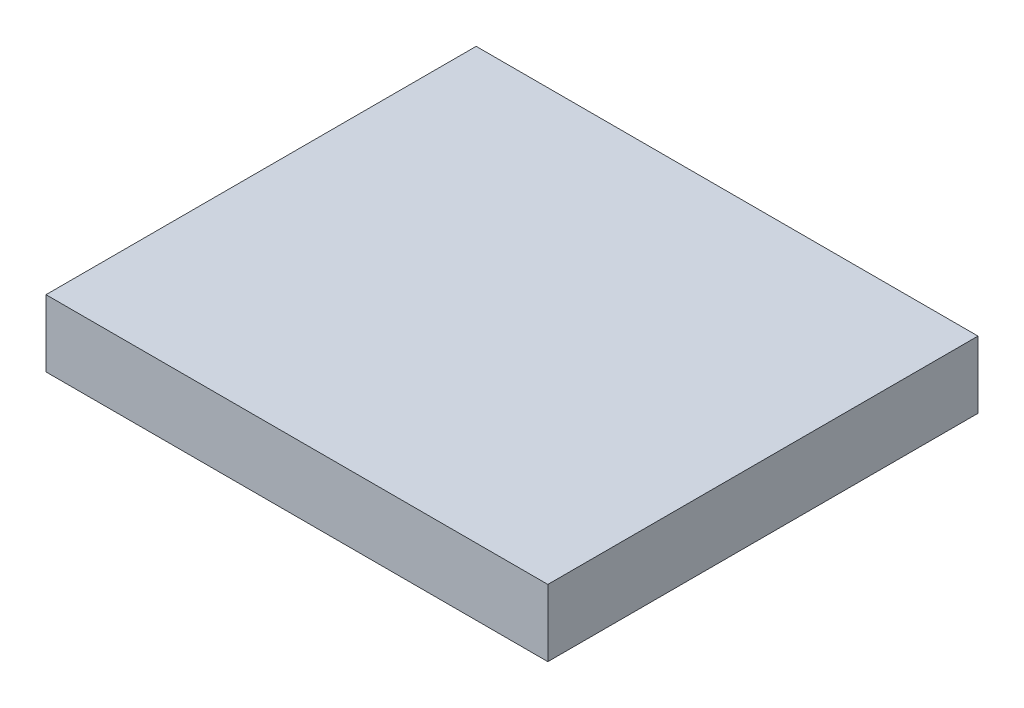
ISO-10303-21;
HEADER;
FILE_DESCRIPTION(('STEP AP214'),'2;1');
FILE_NAME('part.step','',(''),(''),'','','');
FILE_SCHEMA(('AUTOMOTIVE_DESIGN { 1 0 10303 214 1 1 1 1 }'));
ENDSEC;
DATA;
#1=APPLICATION_CONTEXT('core data for automotive mechanical design processes');
#2=APPLICATION_PROTOCOL_DEFINITION('international standard','automotive_design',2000,#1);
#3=PRODUCT_CONTEXT('',#1,'mechanical');
#4=PRODUCT('Part','Part','',(#3));
#5=PRODUCT_RELATED_PRODUCT_CATEGORY('part','',(#4));
#6=PRODUCT_DEFINITION_FORMATION('','',#4);
#7=PRODUCT_DEFINITION_CONTEXT('part definition',#1,'design');
#8=PRODUCT_DEFINITION('design','',#6,#7);
#9=PRODUCT_DEFINITION_SHAPE('','',#8);
#10=(LENGTH_UNIT() NAMED_UNIT(*) SI_UNIT(.MILLI.,.METRE.));
#11=(NAMED_UNIT(*) PLANE_ANGLE_UNIT() SI_UNIT($,.RADIAN.));
#12=(NAMED_UNIT(*) SI_UNIT($,.STERADIAN.) SOLID_ANGLE_UNIT());
#13=UNCERTAINTY_MEASURE_WITH_UNIT(LENGTH_MEASURE(1.E-05),#10,'distance_accuracy_value','');
#14=(GEOMETRIC_REPRESENTATION_CONTEXT(3) GLOBAL_UNCERTAINTY_ASSIGNED_CONTEXT((#13)) GLOBAL_UNIT_ASSIGNED_CONTEXT((#10,
#11,#12)) REPRESENTATION_CONTEXT('',''));
#15=CARTESIAN_POINT('',(0.,0.,0.));
#16=DIRECTION('',(0.,0.,1.));
#17=DIRECTION('',(1.,0.,0.));
#18=AXIS2_PLACEMENT_3D('',#15,#16,#17);
#19=CARTESIAN_POINT('',(0.,2.8,0.));
#20=DIRECTION('',(1.,0.,0.));
#21=DIRECTION('',(0.,0.,-1.));
#22=AXIS2_PLACEMENT_3D('',#19,#20,#21);
#23=PLANE('',#22);
#24=DIRECTION('',(0.,0.,1.));
#25=VECTOR('',#24,1.);
#26=CARTESIAN_POINT('',(0.,0.,0.));
#27=LINE('',#26,#25);
#28=CARTESIAN_POINT('',(0.,0.,-18.));
#29=VERTEX_POINT('',#28);
#30=CARTESIAN_POINT('',(0.,0.,0.));
#31=VERTEX_POINT('',#30);
#32=EDGE_CURVE('E96',#29,#31,#27,.T.);
#33=ORIENTED_EDGE('',*,*,#32,.T.);
#34=DIRECTION('',(0.,-1.,0.));
#35=VECTOR('',#34,1.);
#36=CARTESIAN_POINT('',(0.,2.8,0.));
#37=LINE('',#36,#35);
#38=CARTESIAN_POINT('',(0.,2.8,0.));
#39=VERTEX_POINT('',#38);
#40=EDGE_CURVE('E11',#39,#31,#37,.T.);
#41=ORIENTED_EDGE('',*,*,#40,.F.);
#42=DIRECTION('',(0.,0.,1.));
#43=VECTOR('',#42,1.);
#44=CARTESIAN_POINT('',(0.,2.8,0.));
#45=LINE('',#44,#43);
#46=CARTESIAN_POINT('',(0.,2.8,-18.));
#47=VERTEX_POINT('',#46);
#48=EDGE_CURVE('E84',#47,#39,#45,.T.);
#49=ORIENTED_EDGE('',*,*,#48,.F.);
#50=DIRECTION('',(0.,-1.,0.));
#51=VECTOR('',#50,1.);
#52=CARTESIAN_POINT('',(0.,2.8,-18.));
#53=LINE('',#52,#51);
#54=EDGE_CURVE('E92',#47,#29,#53,.T.);
#55=ORIENTED_EDGE('',*,*,#54,.T.);
#56=EDGE_LOOP('',(#33,#41,#49,#55));
#57=FACE_BOUND('',#56,.T.);
#58=ADVANCED_FACE('F33',(#57),#23,.F.);
#59=CARTESIAN_POINT('',(0.,2.8,0.));
#60=DIRECTION('',(0.,0.,-1.));
#61=DIRECTION('',(-1.,0.,0.));
#62=AXIS2_PLACEMENT_3D('',#59,#60,#61);
#63=PLANE('',#62);
#64=DIRECTION('',(1.,0.,0.));
#65=VECTOR('',#64,1.);
#66=CARTESIAN_POINT('',(0.,0.,0.));
#67=LINE('',#66,#65);
#68=CARTESIAN_POINT('',(20.99999991,0.,0.));
#69=VERTEX_POINT('',#68);
#70=EDGE_CURVE('E88',#31,#69,#67,.T.);
#71=ORIENTED_EDGE('',*,*,#70,.T.);
#72=DIRECTION('',(0.,-1.,0.));
#73=VECTOR('',#72,1.);
#74=CARTESIAN_POINT('',(20.99999991,2.8,0.));
#75=LINE('',#74,#73);
#76=CARTESIAN_POINT('',(20.99999991,2.8,0.));
#77=VERTEX_POINT('',#76);
#78=EDGE_CURVE('E41',#77,#69,#75,.T.);
#79=ORIENTED_EDGE('',*,*,#78,.F.);
#80=DIRECTION('',(1.,0.,0.));
#81=VECTOR('',#80,1.);
#82=CARTESIAN_POINT('',(0.,2.8,0.));
#83=LINE('',#82,#81);
#84=EDGE_CURVE('E79',#39,#77,#83,.T.);
#85=ORIENTED_EDGE('',*,*,#84,.F.);
#86=ORIENTED_EDGE('',*,*,#40,.T.);
#87=EDGE_LOOP('',(#71,#79,#85,#86));
#88=FACE_BOUND('',#87,.T.);
#89=ADVANCED_FACE('F87',(#88),#63,.F.);
#90=CARTESIAN_POINT('',(20.99999991,2.8,0.));
#91=DIRECTION('',(-1.,0.,0.));
#92=DIRECTION('',(0.,0.,1.));
#93=AXIS2_PLACEMENT_3D('',#90,#91,#92);
#94=PLANE('',#93);
#95=DIRECTION('',(0.,0.,-1.));
#96=VECTOR('',#95,1.);
#97=CARTESIAN_POINT('',(20.99999991,0.,0.));
#98=LINE('',#97,#96);
#99=CARTESIAN_POINT('',(20.99999991,0.,-18.));
#100=VERTEX_POINT('',#99);
#101=EDGE_CURVE('E66',#69,#100,#98,.T.);
#102=ORIENTED_EDGE('',*,*,#101,.T.);
#103=DIRECTION('',(0.,-1.,0.));
#104=VECTOR('',#103,1.);
#105=CARTESIAN_POINT('',(20.99999991,2.8,-18.));
#106=LINE('',#105,#104);
#107=CARTESIAN_POINT('',(20.99999991,2.8,-18.));
#108=VERTEX_POINT('',#107);
#109=EDGE_CURVE('E89',#108,#100,#106,.T.);
#110=ORIENTED_EDGE('',*,*,#109,.F.);
#111=DIRECTION('',(0.,0.,-1.));
#112=VECTOR('',#111,1.);
#113=CARTESIAN_POINT('',(20.99999991,2.8,0.));
#114=LINE('',#113,#112);
#115=EDGE_CURVE('E82',#77,#108,#114,.T.);
#116=ORIENTED_EDGE('',*,*,#115,.F.);
#117=ORIENTED_EDGE('',*,*,#78,.T.);
#118=EDGE_LOOP('',(#102,#110,#116,#117));
#119=FACE_BOUND('',#118,.T.);
#120=ADVANCED_FACE('F90',(#119),#94,.F.);
#121=CARTESIAN_POINT('',(0.,2.8,-18.));
#122=DIRECTION('',(0.,0.,1.));
#123=DIRECTION('',(1.,0.,0.));
#124=AXIS2_PLACEMENT_3D('',#121,#122,#123);
#125=PLANE('',#124);
#126=DIRECTION('',(-1.,0.,0.));
#127=VECTOR('',#126,1.);
#128=CARTESIAN_POINT('',(0.,0.,-18.));
#129=LINE('',#128,#127);
#130=EDGE_CURVE('E72',#100,#29,#129,.T.);
#131=ORIENTED_EDGE('',*,*,#130,.T.);
#132=ORIENTED_EDGE('',*,*,#54,.F.);
#133=DIRECTION('',(-1.,0.,0.));
#134=VECTOR('',#133,1.);
#135=CARTESIAN_POINT('',(0.,2.8,-18.));
#136=LINE('',#135,#134);
#137=EDGE_CURVE('E49',#108,#47,#136,.T.);
#138=ORIENTED_EDGE('',*,*,#137,.F.);
#139=ORIENTED_EDGE('',*,*,#109,.T.);
#140=EDGE_LOOP('',(#131,#132,#138,#139));
#141=FACE_BOUND('',#140,.T.);
#142=ADVANCED_FACE('F103',(#141),#125,.F.);
#143=CARTESIAN_POINT('',(0.,2.8,0.));
#144=DIRECTION('',(0.,-1.,0.));
#145=DIRECTION('',(0.,0.,-1.));
#146=AXIS2_PLACEMENT_3D('',#143,#144,#145);
#147=PLANE('',#146);
#148=ORIENTED_EDGE('',*,*,#48,.T.);
#149=ORIENTED_EDGE('',*,*,#84,.T.);
#150=ORIENTED_EDGE('',*,*,#115,.T.);
#151=ORIENTED_EDGE('',*,*,#137,.T.);
#152=EDGE_LOOP('',(#148,#149,#150,#151));
#153=FACE_BOUND('',#152,.T.);
#154=ADVANCED_FACE('F80',(#153),#147,.F.);
#155=CARTESIAN_POINT('',(0.,0.,0.));
#156=DIRECTION('',(0.,-1.,0.));
#157=DIRECTION('',(0.,0.,-1.));
#158=AXIS2_PLACEMENT_3D('',#155,#156,#157);
#159=PLANE('',#158);
#160=ORIENTED_EDGE('',*,*,#32,.F.);
#161=ORIENTED_EDGE('',*,*,#130,.F.);
#162=ORIENTED_EDGE('',*,*,#101,.F.);
#163=ORIENTED_EDGE('',*,*,#70,.F.);
#164=EDGE_LOOP('',(#160,#161,#162,#163));
#165=FACE_BOUND('',#164,.T.);
#166=ADVANCED_FACE('F106',(#165),#159,.T.);
#167=CLOSED_SHELL('',(#58,#89,#120,#142,#154,#166));
#168=MANIFOLD_SOLID_BREP('B2',#167);
#169=ADVANCED_BREP_SHAPE_REPRESENTATION('',(#18,#168),#14);
#170=SHAPE_DEFINITION_REPRESENTATION(#9,#169);
ENDSEC;
END-ISO-10303-21;
